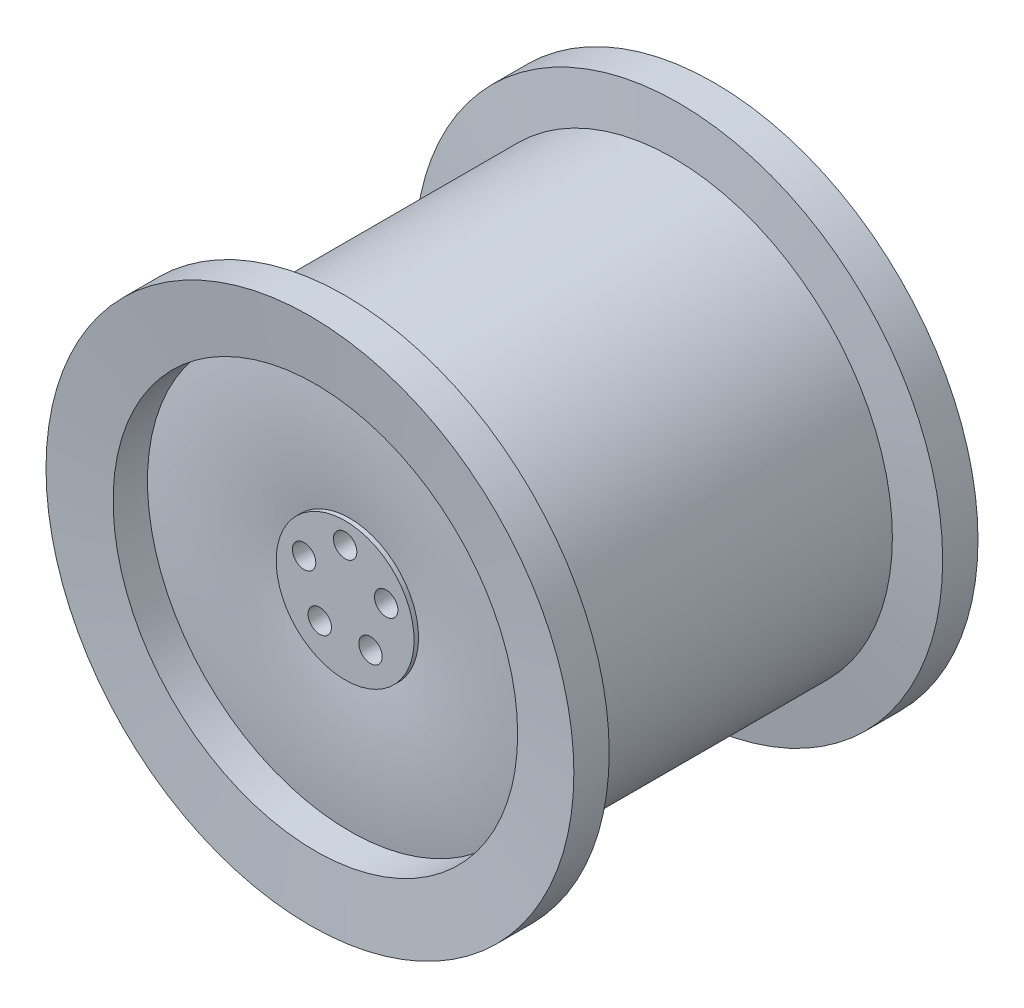
ISO-10303-21;
HEADER;
FILE_DESCRIPTION(('STEP AP214'),'2;1');
FILE_NAME('part.step','',(''),(''),'','','');
FILE_SCHEMA(('AUTOMOTIVE_DESIGN { 1 0 10303 214 1 1 1 1 }'));
ENDSEC;
DATA;
#1=APPLICATION_CONTEXT('core data for automotive mechanical design processes');
#2=APPLICATION_PROTOCOL_DEFINITION('international standard','automotive_design',2000,#1);
#3=PRODUCT_CONTEXT('',#1,'mechanical');
#4=PRODUCT('Part','Part','',(#3));
#5=PRODUCT_RELATED_PRODUCT_CATEGORY('part','',(#4));
#6=PRODUCT_DEFINITION_FORMATION('','',#4);
#7=PRODUCT_DEFINITION_CONTEXT('part definition',#1,'design');
#8=PRODUCT_DEFINITION('design','',#6,#7);
#9=PRODUCT_DEFINITION_SHAPE('','',#8);
#10=(LENGTH_UNIT() NAMED_UNIT(*) SI_UNIT(.MILLI.,.METRE.));
#11=(NAMED_UNIT(*) PLANE_ANGLE_UNIT() SI_UNIT($,.RADIAN.));
#12=(NAMED_UNIT(*) SI_UNIT($,.STERADIAN.) SOLID_ANGLE_UNIT());
#13=UNCERTAINTY_MEASURE_WITH_UNIT(LENGTH_MEASURE(1.E-05),#10,'distance_accuracy_value','');
#14=(GEOMETRIC_REPRESENTATION_CONTEXT(3) GLOBAL_UNCERTAINTY_ASSIGNED_CONTEXT((#13)) GLOBAL_UNIT_ASSIGNED_CONTEXT((#10,
#11,#12)) REPRESENTATION_CONTEXT('',''));
#15=CARTESIAN_POINT('',(0.,0.,0.));
#16=DIRECTION('',(0.,0.,1.));
#17=DIRECTION('',(1.,0.,0.));
#18=AXIS2_PLACEMENT_3D('',#15,#16,#17);
#19=CARTESIAN_POINT('',(0.,42.1931473502692,29.1003362982597));
#20=CARTESIAN_POINT('',(0.,28.8805037735856,31.1921104029189));
#21=CARTESIAN_POINT('',(0.,15.5839236940152,29.1003362982597));
#22=B_SPLINE_CURVE_WITH_KNOTS('',2,(#19,#20,#21),.UNSPECIFIED.,.F.,.F.,(3,3),(0.,1.),.UNSPECIFIED.);
#23=CARTESIAN_POINT('',(0.,4.49161713762444,34.8689949765665));
#24=DIRECTION('',(0.,0.,1.));
#25=AXIS1_PLACEMENT('',#23,#24);
#26=SURFACE_OF_REVOLUTION('',#22,#25);
#27=CARTESIAN_POINT('',(0.,4.49161713762444,29.2809912616535));
#28=DIRECTION('',(0.,0.,1.));
#29=DIRECTION('',(1.,0.,0.));
#30=AXIS2_PLACEMENT_3D('',#27,#28,#29);
#31=CIRCLE('',#30,36.4973602238119);
#32=CARTESIAN_POINT('',(36.4973602238119,4.49161713762444,29.2809912616535));
#33=VERTEX_POINT('',#32);
#34=EDGE_CURVE('E49',#33,#33,#31,.T.);
#35=ORIENTED_EDGE('',*,*,#34,.T.);
#36=EDGE_LOOP('',(#35));
#37=FACE_BOUND('',#36,.T.);
#38=CARTESIAN_POINT('',(0.,4.49161713762444,29.3024208668306));
#39=DIRECTION('',(0.,0.,1.));
#40=DIRECTION('',(1.,0.,0.));
#41=AXIS2_PLACEMENT_3D('',#38,#39,#40);
#42=CIRCLE('',#41,12.4458037374398);
#43=CARTESIAN_POINT('',(12.4458037374398,4.49161713762444,29.3024208668306));
#44=VERTEX_POINT('',#43);
#45=EDGE_CURVE('E10',#44,#44,#42,.T.);
#46=ORIENTED_EDGE('',*,*,#45,.F.);
#47=EDGE_LOOP('',(#46));
#48=FACE_BOUND('',#47,.T.);
#49=ADVANCED_FACE('F37',(#37,#48),#26,.T.);
#50=CARTESIAN_POINT('',(0.,15.5839236940152,26.5414209701872));
#51=CARTESIAN_POINT('',(0.,28.8764957241019,29.106417971599));
#52=CARTESIAN_POINT('',(0.,42.1931473502692,26.5414209701872));
#53=B_SPLINE_CURVE_WITH_KNOTS('',2,(#50,#51,#52),.UNSPECIFIED.,.F.,.F.,(3,3),(0.,1.),.UNSPECIFIED.);
#54=CARTESIAN_POINT('',(0.,4.49161713762444,34.8689949765665));
#55=DIRECTION('',(0.,0.,1.));
#56=AXIS1_PLACEMENT('',#54,#55);
#57=SURFACE_OF_REVOLUTION('',#53,#56);
#58=CARTESIAN_POINT('',(0.,4.49161713762444,26.7628849293076));
#59=DIRECTION('',(0.,0.,1.));
#60=DIRECTION('',(1.,0.,0.));
#61=AXIS2_PLACEMENT_3D('',#58,#59,#60);
#62=CIRCLE('',#61,36.4973602238078);
#63=CARTESIAN_POINT('',(36.4973602238078,4.49161713762444,26.7628849293076));
#64=VERTEX_POINT('',#63);
#65=EDGE_CURVE('E113',#64,#64,#62,.F.);
#66=ORIENTED_EDGE('',*,*,#65,.T.);
#67=EDGE_LOOP('',(#66));
#68=FACE_BOUND('',#67,.T.);
#69=CARTESIAN_POINT('',(0.,4.49161713762444,26.7892903177813));
#70=DIRECTION('',(0.,0.,1.));
#71=DIRECTION('',(1.,0.,0.));
#72=AXIS2_PLACEMENT_3D('',#69,#70,#71);
#73=CIRCLE('',#72,12.4458037374355);
#74=CARTESIAN_POINT('',(12.4458037374355,4.49161713762444,26.7892903177813));
#75=VERTEX_POINT('',#74);
#76=EDGE_CURVE('E41',#75,#75,#73,.F.);
#77=ORIENTED_EDGE('',*,*,#76,.F.);
#78=EDGE_LOOP('',(#77));
#79=FACE_BOUND('',#78,.T.);
#80=ADVANCED_FACE('F69',(#68,#79),#57,.T.);
#81=CARTESIAN_POINT('',(0.,4.49161713762444,34.8689949765665));
#82=DIRECTION('',(0.,0.,1.));
#83=DIRECTION('',(1.,0.,0.));
#84=AXIS2_PLACEMENT_3D('',#81,#82,#83);
#85=CYLINDRICAL_SURFACE('',#84,36.4973602238119);
#86=CARTESIAN_POINT('',(0.,4.49161713762444,35.4782436134048));
#87=DIRECTION('',(0.,0.,1.));
#88=DIRECTION('',(1.,0.,0.));
#89=AXIS2_PLACEMENT_3D('',#86,#87,#88);
#90=CIRCLE('',#89,36.4973602238119);
#91=CARTESIAN_POINT('',(36.4973602238119,4.49161713762444,35.4782436134048));
#92=VERTEX_POINT('',#91);
#93=EDGE_CURVE('E116',#92,#92,#90,.T.);
#94=ORIENTED_EDGE('',*,*,#93,.T.);
#95=EDGE_LOOP('',(#94));
#96=FACE_BOUND('',#95,.T.);
#97=ORIENTED_EDGE('',*,*,#34,.F.);
#98=EDGE_LOOP('',(#97));
#99=FACE_BOUND('',#98,.T.);
#100=ADVANCED_FACE('F90',(#96,#99),#85,.F.);
#101=CARTESIAN_POINT('',(0.,4.49161713762444,-35.4782436134048));
#102=DIRECTION('',(0.,0.,1.));
#103=DIRECTION('',(1.,0.,0.));
#104=AXIS2_PLACEMENT_3D('',#101,#102,#103);
#105=CIRCLE('',#104,36.497360223812);
#106=CARTESIAN_POINT('',(36.497360223812,4.49161713762444,-35.4782436134048));
#107=VERTEX_POINT('',#106);
#108=EDGE_CURVE('E111',#107,#107,#105,.T.);
#109=ORIENTED_EDGE('',*,*,#108,.F.);
#110=EDGE_LOOP('',(#109));
#111=FACE_BOUND('',#110,.T.);
#112=ORIENTED_EDGE('',*,*,#65,.F.);
#113=EDGE_LOOP('',(#112));
#114=FACE_BOUND('',#113,.T.);
#115=ADVANCED_FACE('F93',(#111,#114),#85,.F.);
#116=CARTESIAN_POINT('',(0.,4.49161713762444,-30.0855209678905));
#117=DIRECTION('',(0.,0.,-1.));
#118=DIRECTION('',(-1.,0.,0.));
#119=AXIS2_PLACEMENT_3D('',#116,#117,#118);
#120=CONICAL_SURFACE('',#119,47.6228397423519,1.44958912937335);
#121=CARTESIAN_POINT('',(0.,4.49161713762444,-29.1003362982597));
#122=DIRECTION('',(0.,0.,1.));
#123=DIRECTION('',(1.,0.,0.));
#124=AXIS2_PLACEMENT_3D('',#121,#122,#123);
#125=CIRCLE('',#124,39.5345789072151);
#126=CARTESIAN_POINT('',(39.5345789072151,4.49161713762444,-29.1003362982597));
#127=VERTEX_POINT('',#126);
#128=EDGE_CURVE('E306',#127,#127,#125,.T.);
#129=ORIENTED_EDGE('',*,*,#128,.F.);
#130=EDGE_LOOP('',(#129));
#131=FACE_BOUND('',#130,.T.);
#132=CARTESIAN_POINT('',(0.,4.49161713762444,-30.0855209678905));
#133=DIRECTION('',(0.,0.,1.));
#134=DIRECTION('',(1.,0.,0.));
#135=AXIS2_PLACEMENT_3D('',#132,#133,#134);
#136=CIRCLE('',#135,47.6228397423519);
#137=CARTESIAN_POINT('',(47.6228397423519,4.49161713762444,-30.0855209678905));
#138=VERTEX_POINT('',#137);
#139=EDGE_CURVE('E107',#138,#138,#136,.T.);
#140=ORIENTED_EDGE('',*,*,#139,.T.);
#141=EDGE_LOOP('',(#140));
#142=FACE_BOUND('',#141,.T.);
#143=ADVANCED_FACE('F39',(#131,#142),#120,.T.);
#144=CARTESIAN_POINT('',(0.,4.49161713762444,34.8689949765665));
#145=DIRECTION('',(0.,0.,1.));
#146=DIRECTION('',(1.,0.,0.));
#147=AXIS2_PLACEMENT_3D('',#144,#145,#146);
#148=CYLINDRICAL_SURFACE('',#147,47.6228397423519);
#149=ORIENTED_EDGE('',*,*,#139,.F.);
#150=EDGE_LOOP('',(#149));
#151=FACE_BOUND('',#150,.T.);
#152=CARTESIAN_POINT('',(0.,4.49161713762444,-36.4600840334608));
#153=DIRECTION('',(0.,0.,1.));
#154=DIRECTION('',(1.,0.,0.));
#155=AXIS2_PLACEMENT_3D('',#152,#153,#154);
#156=CIRCLE('',#155,47.6228397423519);
#157=CARTESIAN_POINT('',(47.6228397423519,4.49161713762444,-36.4600840334608));
#158=VERTEX_POINT('',#157);
#159=EDGE_CURVE('E110',#158,#158,#156,.T.);
#160=ORIENTED_EDGE('',*,*,#159,.T.);
#161=EDGE_LOOP('',(#160));
#162=FACE_BOUND('',#161,.T.);
#163=ADVANCED_FACE('F96',(#151,#162),#148,.T.);
#164=CARTESIAN_POINT('',(0.,4.49161713762444,-35.4782436134048));
#165=DIRECTION('',(0.,0.,-1.));
#166=DIRECTION('',(-1.,0.,0.));
#167=AXIS2_PLACEMENT_3D('',#164,#165,#166);
#168=CONICAL_SURFACE('',#167,36.497360223812,1.48277285794723);
#169=ORIENTED_EDGE('',*,*,#159,.F.);
#170=EDGE_LOOP('',(#169));
#171=FACE_BOUND('',#170,.T.);
#172=ORIENTED_EDGE('',*,*,#108,.T.);
#173=EDGE_LOOP('',(#172));
#174=FACE_BOUND('',#173,.T.);
#175=ADVANCED_FACE('F88',(#171,#174),#168,.F.);
#176=CARTESIAN_POINT('',(0.,4.49161713762444,36.4600840334608));
#177=DIRECTION('',(0.,0.,1.));
#178=DIRECTION('',(1.,0.,0.));
#179=AXIS2_PLACEMENT_3D('',#176,#177,#178);
#180=CONICAL_SURFACE('',#179,47.6228397423519,1.48277285794723);
#181=ORIENTED_EDGE('',*,*,#93,.F.);
#182=EDGE_LOOP('',(#181));
#183=FACE_BOUND('',#182,.T.);
#184=CARTESIAN_POINT('',(0.,4.49161713762444,36.4600840334608));
#185=DIRECTION('',(0.,0.,1.));
#186=DIRECTION('',(1.,0.,0.));
#187=AXIS2_PLACEMENT_3D('',#184,#185,#186);
#188=CIRCLE('',#187,47.6228397423519);
#189=CARTESIAN_POINT('',(47.6228397423519,4.49161713762444,36.4600840334608));
#190=VERTEX_POINT('',#189);
#191=EDGE_CURVE('E354',#190,#190,#188,.T.);
#192=ORIENTED_EDGE('',*,*,#191,.T.);
#193=EDGE_LOOP('',(#192));
#194=FACE_BOUND('',#193,.T.);
#195=ADVANCED_FACE('F84',(#183,#194),#180,.F.);
#196=CARTESIAN_POINT('',(0.,4.49161713762444,34.8689949765665));
#197=DIRECTION('',(0.,0.,1.));
#198=DIRECTION('',(1.,0.,0.));
#199=AXIS2_PLACEMENT_3D('',#196,#197,#198);
#200=CYLINDRICAL_SURFACE('',#199,47.6228397423519);
#201=ORIENTED_EDGE('',*,*,#191,.F.);
#202=EDGE_LOOP('',(#201));
#203=FACE_BOUND('',#202,.T.);
#204=CARTESIAN_POINT('',(0.,4.49161713762444,30.0855209678905));
#205=DIRECTION('',(0.,0.,1.));
#206=DIRECTION('',(1.,0.,0.));
#207=AXIS2_PLACEMENT_3D('',#204,#205,#206);
#208=CIRCLE('',#207,47.6228397423519);
#209=CARTESIAN_POINT('',(47.6228397423519,4.49161713762444,30.0855209678905));
#210=VERTEX_POINT('',#209);
#211=EDGE_CURVE('E349',#210,#210,#208,.T.);
#212=ORIENTED_EDGE('',*,*,#211,.T.);
#213=EDGE_LOOP('',(#212));
#214=FACE_BOUND('',#213,.T.);
#215=ADVANCED_FACE('F80',(#203,#214),#200,.T.);
#216=CARTESIAN_POINT('',(0.,4.49161713762444,29.1003362982597));
#217=DIRECTION('',(0.,0.,1.));
#218=DIRECTION('',(1.,0.,0.));
#219=AXIS2_PLACEMENT_3D('',#216,#217,#218);
#220=CONICAL_SURFACE('',#219,39.5345789072151,1.44958912937335);
#221=ORIENTED_EDGE('',*,*,#211,.F.);
#222=EDGE_LOOP('',(#221));
#223=FACE_BOUND('',#222,.T.);
#224=CARTESIAN_POINT('',(0.,4.49161713762444,29.1003362982597));
#225=DIRECTION('',(0.,0.,1.));
#226=DIRECTION('',(1.,0.,0.));
#227=AXIS2_PLACEMENT_3D('',#224,#225,#226);
#228=CIRCLE('',#227,39.5345789072151);
#229=CARTESIAN_POINT('',(39.5345789072151,4.49161713762444,29.1003362982597));
#230=VERTEX_POINT('',#229);
#231=EDGE_CURVE('E345',#230,#230,#228,.T.);
#232=ORIENTED_EDGE('',*,*,#231,.T.);
#233=EDGE_LOOP('',(#232));
#234=FACE_BOUND('',#233,.T.);
#235=ADVANCED_FACE('F76',(#223,#234),#220,.T.);
#236=CARTESIAN_POINT('',(0.,4.49161713762444,34.8689949765665));
#237=DIRECTION('',(0.,0.,1.));
#238=DIRECTION('',(1.,0.,0.));
#239=AXIS2_PLACEMENT_3D('',#236,#237,#238);
#240=CYLINDRICAL_SURFACE('',#239,39.5345789072151);
#241=ORIENTED_EDGE('',*,*,#231,.F.);
#242=EDGE_LOOP('',(#241));
#243=FACE_BOUND('',#242,.T.);
#244=ORIENTED_EDGE('',*,*,#128,.T.);
#245=EDGE_LOOP('',(#244));
#246=FACE_BOUND('',#245,.T.);
#247=ADVANCED_FACE('F72',(#243,#246),#240,.T.);
#248=CARTESIAN_POINT('',(0.,4.49161713762444,30.1085903945307));
#249=DIRECTION('',(0.,0.,-1.));
#250=DIRECTION('',(-1.,0.,0.));
#251=AXIS2_PLACEMENT_3D('',#248,#249,#250);
#252=CYLINDRICAL_SURFACE('',#251,12.4458037374398);
#253=CARTESIAN_POINT('',(0.,4.49161713762444,30.1085903945307));
#254=DIRECTION('',(0.,0.,1.));
#255=DIRECTION('',(1.,0.,0.));
#256=AXIS2_PLACEMENT_3D('',#253,#254,#255);
#257=CIRCLE('',#256,12.4458037374398);
#258=CARTESIAN_POINT('',(12.4458037374398,4.49161713762444,30.1085903945307));
#259=VERTEX_POINT('',#258);
#260=EDGE_CURVE('E303',#259,#259,#257,.T.);
#261=ORIENTED_EDGE('',*,*,#260,.F.);
#262=EDGE_LOOP('',(#261));
#263=FACE_BOUND('',#262,.T.);
#264=ORIENTED_EDGE('',*,*,#45,.T.);
#265=EDGE_LOOP('',(#264));
#266=FACE_BOUND('',#265,.T.);
#267=ADVANCED_FACE('F75',(#263,#266),#252,.T.);
#268=CARTESIAN_POINT('',(0.,4.49161713762444,22.1471541310248));
#269=DIRECTION('',(0.,0.,1.));
#270=DIRECTION('',(1.,0.,0.));
#271=AXIS2_PLACEMENT_3D('',#268,#269,#270);
#272=CIRCLE('',#271,12.4458037374398);
#273=CARTESIAN_POINT('',(12.4458037374398,4.49161713762444,22.1471541310248));
#274=VERTEX_POINT('',#273);
#275=EDGE_CURVE('E292',#274,#274,#272,.T.);
#276=ORIENTED_EDGE('',*,*,#275,.T.);
#277=EDGE_LOOP('',(#276));
#278=FACE_BOUND('',#277,.T.);
#279=ORIENTED_EDGE('',*,*,#76,.T.);
#280=EDGE_LOOP('',(#279));
#281=FACE_BOUND('',#280,.T.);
#282=ADVANCED_FACE('F205',(#278,#281),#252,.T.);
#283=CARTESIAN_POINT('',(0.,4.49161713762444,30.1085903945307));
#284=DIRECTION('',(0.,0.,1.));
#285=DIRECTION('',(1.,0.,0.));
#286=AXIS2_PLACEMENT_3D('',#283,#284,#285);
#287=PLANE('',#286);
#288=CARTESIAN_POINT('',(0.,13.0957582014339,30.1085903945307));
#289=DIRECTION('',(0.,0.,1.));
#290=DIRECTION('',(1.,0.,0.));
#291=AXIS2_PLACEMENT_3D('',#288,#289,#290);
#292=CIRCLE('',#291,2.11040837393591);
#293=CARTESIAN_POINT('',(2.11040837393591,13.0957582014339,30.1085903945307));
#294=VERTEX_POINT('',#293);
#295=EDGE_CURVE('E288',#294,#294,#292,.T.);
#296=ORIENTED_EDGE('',*,*,#295,.F.);
#297=EDGE_LOOP('',(#296));
#298=FACE_BOUND('',#297,.T.);
#299=CARTESIAN_POINT('',(7.40715963781489,7.71414171283663,30.1085903945307));
#300=DIRECTION('',(0.,0.,1.));
#301=DIRECTION('',(1.,0.,0.));
#302=AXIS2_PLACEMENT_3D('',#299,#300,#301);
#303=CIRCLE('',#302,2.11040837393591);
#304=CARTESIAN_POINT('',(9.5175680117508,7.71414171283663,30.1085903945307));
#305=VERTEX_POINT('',#304);
#306=EDGE_CURVE('E291',#305,#305,#303,.T.);
#307=ORIENTED_EDGE('',*,*,#306,.F.);
#308=EDGE_LOOP('',(#307));
#309=FACE_BOUND('',#308,.T.);
#310=CARTESIAN_POINT('',(4.57787641626596,-0.99349668013066,30.1085903945307));
#311=DIRECTION('',(0.,0.,1.));
#312=DIRECTION('',(1.,0.,0.));
#313=AXIS2_PLACEMENT_3D('',#310,#311,#312);
#314=CIRCLE('',#313,2.11040837393591);
#315=CARTESIAN_POINT('',(6.68828479020187,-0.99349668013066,30.1085903945307));
#316=VERTEX_POINT('',#315);
#317=EDGE_CURVE('E299',#316,#316,#314,.T.);
#318=ORIENTED_EDGE('',*,*,#317,.F.);
#319=EDGE_LOOP('',(#318));
#320=FACE_BOUND('',#319,.T.);
#321=CARTESIAN_POINT('',(-4.57787641626596,-0.993496680130665,30.1085903945307));
#322=DIRECTION('',(0.,0.,1.));
#323=DIRECTION('',(1.,0.,0.));
#324=AXIS2_PLACEMENT_3D('',#321,#322,#323);
#325=CIRCLE('',#324,2.11040837393591);
#326=CARTESIAN_POINT('',(-2.46746804233005,-0.993496680130665,30.1085903945307));
#327=VERTEX_POINT('',#326);
#328=EDGE_CURVE('E316',#327,#327,#325,.T.);
#329=ORIENTED_EDGE('',*,*,#328,.F.);
#330=EDGE_LOOP('',(#329));
#331=FACE_BOUND('',#330,.T.);
#332=CARTESIAN_POINT('',(-7.40715963781489,7.71414171283663,30.1085903945307));
#333=DIRECTION('',(0.,0.,1.));
#334=DIRECTION('',(1.,0.,0.));
#335=AXIS2_PLACEMENT_3D('',#332,#333,#334);
#336=CIRCLE('',#335,2.11040837393591);
#337=CARTESIAN_POINT('',(-5.29675126387898,7.71414171283663,30.1085903945307));
#338=VERTEX_POINT('',#337);
#339=EDGE_CURVE('E312',#338,#338,#336,.T.);
#340=ORIENTED_EDGE('',*,*,#339,.F.);
#341=EDGE_LOOP('',(#340));
#342=FACE_BOUND('',#341,.T.);
#343=ORIENTED_EDGE('',*,*,#260,.T.);
#344=EDGE_LOOP('',(#343));
#345=FACE_BOUND('',#344,.T.);
#346=ADVANCED_FACE('F213',(#298,#309,#320,#331,#342,#345),#287,.T.);
#347=CARTESIAN_POINT('',(0.,4.49161713762444,22.1471541310248));
#348=DIRECTION('',(0.,0.,1.));
#349=DIRECTION('',(1.,0.,0.));
#350=AXIS2_PLACEMENT_3D('',#347,#348,#349);
#351=PLANE('',#350);
#352=CARTESIAN_POINT('',(0.,13.0957582014339,22.1471541310248));
#353=DIRECTION('',(0.,0.,1.));
#354=DIRECTION('',(1.,0.,0.));
#355=AXIS2_PLACEMENT_3D('',#352,#353,#354);
#356=CIRCLE('',#355,2.11040837393591);
#357=CARTESIAN_POINT('',(2.11040837393591,13.0957582014339,22.1471541310248));
#358=VERTEX_POINT('',#357);
#359=EDGE_CURVE('E52',#358,#358,#356,.T.);
#360=ORIENTED_EDGE('',*,*,#359,.T.);
#361=EDGE_LOOP('',(#360));
#362=FACE_BOUND('',#361,.T.);
#363=CARTESIAN_POINT('',(7.40715963781489,7.71414171283663,22.1471541310248));
#364=DIRECTION('',(0.,0.,1.));
#365=DIRECTION('',(1.,0.,0.));
#366=AXIS2_PLACEMENT_3D('',#363,#364,#365);
#367=CIRCLE('',#366,2.11040837393591);
#368=CARTESIAN_POINT('',(9.5175680117508,7.71414171283663,22.1471541310248));
#369=VERTEX_POINT('',#368);
#370=EDGE_CURVE('E295',#369,#369,#367,.T.);
#371=ORIENTED_EDGE('',*,*,#370,.T.);
#372=EDGE_LOOP('',(#371));
#373=FACE_BOUND('',#372,.T.);
#374=CARTESIAN_POINT('',(4.57787641626596,-0.99349668013066,22.1471541310248));
#375=DIRECTION('',(0.,0.,1.));
#376=DIRECTION('',(1.,0.,0.));
#377=AXIS2_PLACEMENT_3D('',#374,#375,#376);
#378=CIRCLE('',#377,2.11040837393591);
#379=CARTESIAN_POINT('',(6.68828479020187,-0.99349668013066,22.1471541310248));
#380=VERTEX_POINT('',#379);
#381=EDGE_CURVE('E317',#380,#380,#378,.T.);
#382=ORIENTED_EDGE('',*,*,#381,.T.);
#383=EDGE_LOOP('',(#382));
#384=FACE_BOUND('',#383,.T.);
#385=CARTESIAN_POINT('',(-4.57787641626596,-0.993496680130665,22.1471541310248));
#386=DIRECTION('',(0.,0.,1.));
#387=DIRECTION('',(1.,0.,0.));
#388=AXIS2_PLACEMENT_3D('',#385,#386,#387);
#389=CIRCLE('',#388,2.11040837393591);
#390=CARTESIAN_POINT('',(-2.46746804233005,-0.993496680130665,22.1471541310248));
#391=VERTEX_POINT('',#390);
#392=EDGE_CURVE('E313',#391,#391,#389,.T.);
#393=ORIENTED_EDGE('',*,*,#392,.T.);
#394=EDGE_LOOP('',(#393));
#395=FACE_BOUND('',#394,.T.);
#396=CARTESIAN_POINT('',(-7.40715963781489,7.71414171283663,22.1471541310248));
#397=DIRECTION('',(0.,0.,1.));
#398=DIRECTION('',(1.,0.,0.));
#399=AXIS2_PLACEMENT_3D('',#396,#397,#398);
#400=CIRCLE('',#399,2.11040837393591);
#401=CARTESIAN_POINT('',(-5.29675126387898,7.71414171283663,22.1471541310248));
#402=VERTEX_POINT('',#401);
#403=EDGE_CURVE('E309',#402,#402,#400,.T.);
#404=ORIENTED_EDGE('',*,*,#403,.T.);
#405=EDGE_LOOP('',(#404));
#406=FACE_BOUND('',#405,.T.);
#407=ORIENTED_EDGE('',*,*,#275,.F.);
#408=EDGE_LOOP('',(#407));
#409=FACE_BOUND('',#408,.T.);
#410=ADVANCED_FACE('F221',(#362,#373,#384,#395,#406,#409),#351,.F.);
#411=CARTESIAN_POINT('',(-7.40715963781489,7.71414171283663,-96.774));
#412=DIRECTION('',(0.,0.,1.));
#413=DIRECTION('',(1.,0.,0.));
#414=AXIS2_PLACEMENT_3D('',#411,#412,#413);
#415=CYLINDRICAL_SURFACE('',#414,2.11040837393591);
#416=ORIENTED_EDGE('',*,*,#339,.T.);
#417=EDGE_LOOP('',(#416));
#418=FACE_BOUND('',#417,.T.);
#419=ORIENTED_EDGE('',*,*,#403,.F.);
#420=EDGE_LOOP('',(#419));
#421=FACE_BOUND('',#420,.T.);
#422=ADVANCED_FACE('F230',(#418,#421),#415,.F.);
#423=CARTESIAN_POINT('',(-4.57787641626596,-0.993496680130665,-96.774));
#424=DIRECTION('',(0.,0.,1.));
#425=DIRECTION('',(1.,0.,0.));
#426=AXIS2_PLACEMENT_3D('',#423,#424,#425);
#427=CYLINDRICAL_SURFACE('',#426,2.11040837393591);
#428=ORIENTED_EDGE('',*,*,#328,.T.);
#429=EDGE_LOOP('',(#428));
#430=FACE_BOUND('',#429,.T.);
#431=ORIENTED_EDGE('',*,*,#392,.F.);
#432=EDGE_LOOP('',(#431));
#433=FACE_BOUND('',#432,.T.);
#434=ADVANCED_FACE('F239',(#430,#433),#427,.F.);
#435=CARTESIAN_POINT('',(4.57787641626596,-0.99349668013066,-96.774));
#436=DIRECTION('',(0.,0.,1.));
#437=DIRECTION('',(1.,0.,0.));
#438=AXIS2_PLACEMENT_3D('',#435,#436,#437);
#439=CYLINDRICAL_SURFACE('',#438,2.11040837393591);
#440=ORIENTED_EDGE('',*,*,#317,.T.);
#441=EDGE_LOOP('',(#440));
#442=FACE_BOUND('',#441,.T.);
#443=ORIENTED_EDGE('',*,*,#381,.F.);
#444=EDGE_LOOP('',(#443));
#445=FACE_BOUND('',#444,.T.);
#446=ADVANCED_FACE('F248',(#442,#445),#439,.F.);
#447=CARTESIAN_POINT('',(7.40715963781489,7.71414171283663,-96.774));
#448=DIRECTION('',(0.,0.,1.));
#449=DIRECTION('',(1.,0.,0.));
#450=AXIS2_PLACEMENT_3D('',#447,#448,#449);
#451=CYLINDRICAL_SURFACE('',#450,2.11040837393591);
#452=ORIENTED_EDGE('',*,*,#306,.T.);
#453=EDGE_LOOP('',(#452));
#454=FACE_BOUND('',#453,.T.);
#455=ORIENTED_EDGE('',*,*,#370,.F.);
#456=EDGE_LOOP('',(#455));
#457=FACE_BOUND('',#456,.T.);
#458=ADVANCED_FACE('F257',(#454,#457),#451,.F.);
#459=CARTESIAN_POINT('',(0.,13.0957582014339,-96.774));
#460=DIRECTION('',(0.,0.,1.));
#461=DIRECTION('',(1.,0.,0.));
#462=AXIS2_PLACEMENT_3D('',#459,#460,#461);
#463=CYLINDRICAL_SURFACE('',#462,2.11040837393591);
#464=ORIENTED_EDGE('',*,*,#295,.T.);
#465=EDGE_LOOP('',(#464));
#466=FACE_BOUND('',#465,.T.);
#467=ORIENTED_EDGE('',*,*,#359,.F.);
#468=EDGE_LOOP('',(#467));
#469=FACE_BOUND('',#468,.T.);
#470=ADVANCED_FACE('F265',(#466,#469),#463,.F.);
#471=CLOSED_SHELL('',(#49,#80,#100,#115,#143,#163,#175,#195,#215,#235,#247,#267,#282,#346,#410,
#422,#434,#446,#458,#470));
#472=MANIFOLD_SOLID_BREP('B2',#471);
#473=ADVANCED_BREP_SHAPE_REPRESENTATION('',(#18,#472),#14);
#474=SHAPE_DEFINITION_REPRESENTATION(#9,#473);
ENDSEC;
END-ISO-10303-21;
